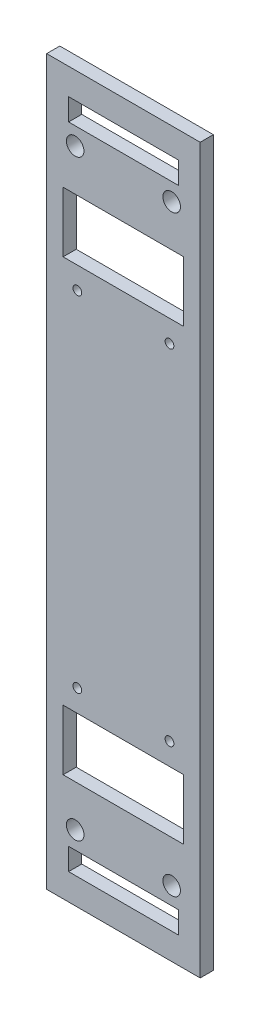
ISO-10303-21;
HEADER;
FILE_DESCRIPTION(('STEP AP214'),'2;1');
FILE_NAME('part.step','',(''),(''),'','','');
FILE_SCHEMA(('AUTOMOTIVE_DESIGN { 1 0 10303 214 1 1 1 1 }'));
ENDSEC;
DATA;
#1=APPLICATION_CONTEXT('core data for automotive mechanical design processes');
#2=APPLICATION_PROTOCOL_DEFINITION('international standard','automotive_design',2000,#1);
#3=PRODUCT_CONTEXT('',#1,'mechanical');
#4=PRODUCT('Part','Part','',(#3));
#5=PRODUCT_RELATED_PRODUCT_CATEGORY('part','',(#4));
#6=PRODUCT_DEFINITION_FORMATION('','',#4);
#7=PRODUCT_DEFINITION_CONTEXT('part definition',#1,'design');
#8=PRODUCT_DEFINITION('design','',#6,#7);
#9=PRODUCT_DEFINITION_SHAPE('','',#8);
#10=(LENGTH_UNIT() NAMED_UNIT(*) SI_UNIT(.MILLI.,.METRE.));
#11=(NAMED_UNIT(*) PLANE_ANGLE_UNIT() SI_UNIT($,.RADIAN.));
#12=(NAMED_UNIT(*) SI_UNIT($,.STERADIAN.) SOLID_ANGLE_UNIT());
#13=UNCERTAINTY_MEASURE_WITH_UNIT(LENGTH_MEASURE(1.E-05),#10,'distance_accuracy_value','');
#14=(GEOMETRIC_REPRESENTATION_CONTEXT(3) GLOBAL_UNCERTAINTY_ASSIGNED_CONTEXT((#13)) GLOBAL_UNIT_ASSIGNED_CONTEXT((#10,
#11,#12)) REPRESENTATION_CONTEXT('',''));
#15=CARTESIAN_POINT('',(0.,0.,0.));
#16=DIRECTION('',(0.,0.,1.));
#17=DIRECTION('',(1.,0.,0.));
#18=AXIS2_PLACEMENT_3D('',#15,#16,#17);
#19=CARTESIAN_POINT('',(35.,165.,6.));
#20=DIRECTION('',(-1.,0.,0.));
#21=DIRECTION('',(0.,-1.,0.));
#22=AXIS2_PLACEMENT_3D('',#19,#20,#21);
#23=PLANE('',#22);
#24=DIRECTION('',(0.,1.,0.));
#25=VECTOR('',#24,1.);
#26=CARTESIAN_POINT('',(35.,165.,0.));
#27=LINE('',#26,#25);
#28=CARTESIAN_POINT('',(35.,-165.,0.));
#29=VERTEX_POINT('',#28);
#30=CARTESIAN_POINT('',(35.,165.,0.));
#31=VERTEX_POINT('',#30);
#32=EDGE_CURVE('E345',#29,#31,#27,.T.);
#33=ORIENTED_EDGE('',*,*,#32,.T.);
#34=DIRECTION('',(0.,0.,-1.));
#35=VECTOR('',#34,1.);
#36=CARTESIAN_POINT('',(35.,165.,6.));
#37=LINE('',#36,#35);
#38=CARTESIAN_POINT('',(35.,165.,6.));
#39=VERTEX_POINT('',#38);
#40=EDGE_CURVE('E11',#39,#31,#37,.T.);
#41=ORIENTED_EDGE('',*,*,#40,.F.);
#42=DIRECTION('',(0.,1.,0.));
#43=VECTOR('',#42,1.);
#44=CARTESIAN_POINT('',(35.,165.,6.));
#45=LINE('',#44,#43);
#46=CARTESIAN_POINT('',(35.,-165.,6.));
#47=VERTEX_POINT('',#46);
#48=EDGE_CURVE('E352',#47,#39,#45,.T.);
#49=ORIENTED_EDGE('',*,*,#48,.F.);
#50=DIRECTION('',(0.,0.,-1.));
#51=VECTOR('',#50,1.);
#52=CARTESIAN_POINT('',(35.,-165.,6.));
#53=LINE('',#52,#51);
#54=EDGE_CURVE('E362',#47,#29,#53,.T.);
#55=ORIENTED_EDGE('',*,*,#54,.T.);
#56=EDGE_LOOP('',(#33,#41,#49,#55));
#57=FACE_BOUND('',#56,.T.);
#58=ADVANCED_FACE('F35',(#57),#23,.F.);
#59=CARTESIAN_POINT('',(-35.,165.,6.));
#60=DIRECTION('',(0.,-1.,0.));
#61=DIRECTION('',(0.,0.,-1.));
#62=AXIS2_PLACEMENT_3D('',#59,#60,#61);
#63=PLANE('',#62);
#64=DIRECTION('',(-1.,0.,0.));
#65=VECTOR('',#64,1.);
#66=CARTESIAN_POINT('',(-35.,165.,0.));
#67=LINE('',#66,#65);
#68=CARTESIAN_POINT('',(-35.,165.,0.));
#69=VERTEX_POINT('',#68);
#70=EDGE_CURVE('E365',#31,#69,#67,.T.);
#71=ORIENTED_EDGE('',*,*,#70,.T.);
#72=DIRECTION('',(0.,0.,-1.));
#73=VECTOR('',#72,1.);
#74=CARTESIAN_POINT('',(-35.,165.,6.));
#75=LINE('',#74,#73);
#76=CARTESIAN_POINT('',(-35.,165.,6.));
#77=VERTEX_POINT('',#76);
#78=EDGE_CURVE('E42',#77,#69,#75,.T.);
#79=ORIENTED_EDGE('',*,*,#78,.F.);
#80=DIRECTION('',(-1.,0.,0.));
#81=VECTOR('',#80,1.);
#82=CARTESIAN_POINT('',(-35.,165.,6.));
#83=LINE('',#82,#81);
#84=EDGE_CURVE('E355',#39,#77,#83,.T.);
#85=ORIENTED_EDGE('',*,*,#84,.F.);
#86=ORIENTED_EDGE('',*,*,#40,.T.);
#87=EDGE_LOOP('',(#71,#79,#85,#86));
#88=FACE_BOUND('',#87,.T.);
#89=ADVANCED_FACE('F394',(#88),#63,.F.);
#90=CARTESIAN_POINT('',(-35.,165.,6.));
#91=DIRECTION('',(1.,0.,0.));
#92=DIRECTION('',(0.,1.,0.));
#93=AXIS2_PLACEMENT_3D('',#90,#91,#92);
#94=PLANE('',#93);
#95=DIRECTION('',(0.,-1.,0.));
#96=VECTOR('',#95,1.);
#97=CARTESIAN_POINT('',(-35.,165.,0.));
#98=LINE('',#97,#96);
#99=CARTESIAN_POINT('',(-35.,-165.,0.));
#100=VERTEX_POINT('',#99);
#101=EDGE_CURVE('E367',#69,#100,#98,.T.);
#102=ORIENTED_EDGE('',*,*,#101,.T.);
#103=DIRECTION('',(0.,0.,-1.));
#104=VECTOR('',#103,1.);
#105=CARTESIAN_POINT('',(-35.,-165.,6.));
#106=LINE('',#105,#104);
#107=CARTESIAN_POINT('',(-35.,-165.,6.));
#108=VERTEX_POINT('',#107);
#109=EDGE_CURVE('E372',#108,#100,#106,.T.);
#110=ORIENTED_EDGE('',*,*,#109,.F.);
#111=DIRECTION('',(0.,-1.,0.));
#112=VECTOR('',#111,1.);
#113=CARTESIAN_POINT('',(-35.,165.,6.));
#114=LINE('',#113,#112);
#115=EDGE_CURVE('E358',#77,#108,#114,.T.);
#116=ORIENTED_EDGE('',*,*,#115,.F.);
#117=ORIENTED_EDGE('',*,*,#78,.T.);
#118=EDGE_LOOP('',(#102,#110,#116,#117));
#119=FACE_BOUND('',#118,.T.);
#120=ADVANCED_FACE('F379',(#119),#94,.F.);
#121=CARTESIAN_POINT('',(-35.,-165.,6.));
#122=DIRECTION('',(0.,1.,0.));
#123=DIRECTION('',(0.,0.,1.));
#124=AXIS2_PLACEMENT_3D('',#121,#122,#123);
#125=PLANE('',#124);
#126=DIRECTION('',(1.,0.,0.));
#127=VECTOR('',#126,1.);
#128=CARTESIAN_POINT('',(-35.,-165.,0.));
#129=LINE('',#128,#127);
#130=EDGE_CURVE('E356',#100,#29,#129,.T.);
#131=ORIENTED_EDGE('',*,*,#130,.T.);
#132=ORIENTED_EDGE('',*,*,#54,.F.);
#133=DIRECTION('',(1.,0.,0.));
#134=VECTOR('',#133,1.);
#135=CARTESIAN_POINT('',(-35.,-165.,6.));
#136=LINE('',#135,#134);
#137=EDGE_CURVE('E360',#108,#47,#136,.T.);
#138=ORIENTED_EDGE('',*,*,#137,.F.);
#139=ORIENTED_EDGE('',*,*,#109,.T.);
#140=EDGE_LOOP('',(#131,#132,#138,#139));
#141=FACE_BOUND('',#140,.T.);
#142=ADVANCED_FACE('F387',(#141),#125,.F.);
#143=CARTESIAN_POINT('',(0.,0.,6.));
#144=DIRECTION('',(0.,0.,1.));
#145=DIRECTION('',(1.,0.,0.));
#146=AXIS2_PLACEMENT_3D('',#143,#144,#145);
#147=PLANE('',#146);
#148=DIRECTION('',(0.,-1.,0.));
#149=VECTOR('',#148,1.);
#150=CARTESIAN_POINT('',(-25.,-153.,5.99999999999893));
#151=LINE('',#150,#149);
#152=CARTESIAN_POINT('',(-25.,-143.,5.999999999999));
#153=VERTEX_POINT('',#152);
#154=CARTESIAN_POINT('',(-25.,-153.,6.));
#155=VERTEX_POINT('',#154);
#156=EDGE_CURVE('E49',#153,#155,#151,.T.);
#157=ORIENTED_EDGE('',*,*,#156,.F.);
#158=DIRECTION('',(-1.,0.,0.));
#159=VECTOR('',#158,1.);
#160=CARTESIAN_POINT('',(-25.,-143.,5.999999999999));
#161=LINE('',#160,#159);
#162=CARTESIAN_POINT('',(25.,-143.,5.999999999999));
#163=VERTEX_POINT('',#162);
#164=EDGE_CURVE('E189',#163,#153,#161,.T.);
#165=ORIENTED_EDGE('',*,*,#164,.F.);
#166=DIRECTION('',(0.,1.,0.));
#167=VECTOR('',#166,1.);
#168=CARTESIAN_POINT('',(25.,-153.,5.99999999999893));
#169=LINE('',#168,#167);
#170=CARTESIAN_POINT('',(25.,-153.,5.99999999999893));
#171=VERTEX_POINT('',#170);
#172=EDGE_CURVE('E192',#171,#163,#169,.T.);
#173=ORIENTED_EDGE('',*,*,#172,.F.);
#174=DIRECTION('',(1.,0.,0.));
#175=VECTOR('',#174,1.);
#176=CARTESIAN_POINT('',(-25.,-153.,5.99999999999893));
#177=LINE('',#176,#175);
#178=EDGE_CURVE('E198',#155,#171,#177,.T.);
#179=ORIENTED_EDGE('',*,*,#178,.F.);
#180=EDGE_LOOP('',(#157,#165,#173,#179));
#181=FACE_BOUND('',#180,.T.);
#182=CARTESIAN_POINT('',(22.,-135.,5.99999999999906));
#183=DIRECTION('',(0.,0.,1.));
#184=DIRECTION('',(0.,-1.,0.));
#185=AXIS2_PLACEMENT_3D('',#182,#183,#184);
#186=CIRCLE('',#185,4.00000000000005);
#187=CARTESIAN_POINT('',(22.,-139.,5.99999999999903));
#188=VERTEX_POINT('',#187);
#189=EDGE_CURVE('E204',#188,#188,#186,.T.);
#190=ORIENTED_EDGE('',*,*,#189,.F.);
#191=EDGE_LOOP('',(#190));
#192=FACE_BOUND('',#191,.T.);
#193=CARTESIAN_POINT('',(-22.,-135.,5.99999999999906));
#194=DIRECTION('',(0.,0.,1.));
#195=DIRECTION('',(0.,1.,0.));
#196=AXIS2_PLACEMENT_3D('',#193,#194,#195);
#197=CIRCLE('',#196,3.99999999999999);
#198=CARTESIAN_POINT('',(-22.,-131.,5.99999999999909));
#199=VERTEX_POINT('',#198);
#200=EDGE_CURVE('E211',#199,#199,#197,.T.);
#201=ORIENTED_EDGE('',*,*,#200,.F.);
#202=EDGE_LOOP('',(#201));
#203=FACE_BOUND('',#202,.T.);
#204=CARTESIAN_POINT('',(21.,-78.5000000000001,5.99999999999945));
#205=DIRECTION('',(0.,0.,1.));
#206=DIRECTION('',(0.,-1.,0.));
#207=AXIS2_PLACEMENT_3D('',#204,#205,#206);
#208=CIRCLE('',#207,2.);
#209=CARTESIAN_POINT('',(21.,-80.5000000000001,5.99999999999944));
#210=VERTEX_POINT('',#209);
#211=EDGE_CURVE('E217',#210,#210,#208,.T.);
#212=ORIENTED_EDGE('',*,*,#211,.F.);
#213=EDGE_LOOP('',(#212));
#214=FACE_BOUND('',#213,.T.);
#215=CARTESIAN_POINT('',(-21.,-78.5000000000001,5.99999999999945));
#216=DIRECTION('',(0.,0.,1.));
#217=DIRECTION('',(0.,1.,0.));
#218=AXIS2_PLACEMENT_3D('',#215,#216,#217);
#219=CIRCLE('',#218,2.);
#220=CARTESIAN_POINT('',(-21.,-76.5000000000001,5.99999999999947));
#221=VERTEX_POINT('',#220);
#222=EDGE_CURVE('E223',#221,#221,#219,.T.);
#223=ORIENTED_EDGE('',*,*,#222,.F.);
#224=EDGE_LOOP('',(#223));
#225=FACE_BOUND('',#224,.T.);
#226=DIRECTION('',(0.,-1.,0.));
#227=VECTOR('',#226,1.);
#228=CARTESIAN_POINT('',(-27.5,-116.,5.99999999999919));
#229=LINE('',#228,#227);
#230=CARTESIAN_POINT('',(-27.5,-88.5000000000001,5.99999999999938));
#231=VERTEX_POINT('',#230);
#232=CARTESIAN_POINT('',(-27.5,-116.,6.));
#233=VERTEX_POINT('',#232);
#234=EDGE_CURVE('E229',#231,#233,#229,.T.);
#235=ORIENTED_EDGE('',*,*,#234,.F.);
#236=DIRECTION('',(-1.,0.,0.));
#237=VECTOR('',#236,1.);
#238=CARTESIAN_POINT('',(-27.5,-88.5000000000001,5.99999999999938));
#239=LINE('',#238,#237);
#240=CARTESIAN_POINT('',(27.5,-88.5000000000001,5.99999999999938));
#241=VERTEX_POINT('',#240);
#242=EDGE_CURVE('E236',#241,#231,#239,.T.);
#243=ORIENTED_EDGE('',*,*,#242,.F.);
#244=DIRECTION('',(0.,1.,0.));
#245=VECTOR('',#244,1.);
#246=CARTESIAN_POINT('',(27.5,-116.,5.99999999999919));
#247=LINE('',#246,#245);
#248=CARTESIAN_POINT('',(27.5,-116.,5.99999999999919));
#249=VERTEX_POINT('',#248);
#250=EDGE_CURVE('E250',#249,#241,#247,.T.);
#251=ORIENTED_EDGE('',*,*,#250,.F.);
#252=DIRECTION('',(1.,0.,0.));
#253=VECTOR('',#252,1.);
#254=CARTESIAN_POINT('',(-27.5,-116.,5.99999999999919));
#255=LINE('',#254,#253);
#256=EDGE_CURVE('E247',#233,#249,#255,.T.);
#257=ORIENTED_EDGE('',*,*,#256,.F.);
#258=EDGE_LOOP('',(#235,#243,#251,#257));
#259=FACE_BOUND('',#258,.T.);
#260=DIRECTION('',(0.,-1.,0.));
#261=VECTOR('',#260,1.);
#262=CARTESIAN_POINT('',(-25.,153.,6.));
#263=LINE('',#262,#261);
#264=CARTESIAN_POINT('',(-25.,153.,6.));
#265=VERTEX_POINT('',#264);
#266=CARTESIAN_POINT('',(-25.,143.,6.));
#267=VERTEX_POINT('',#266);
#268=EDGE_CURVE('E257',#265,#267,#263,.T.);
#269=ORIENTED_EDGE('',*,*,#268,.F.);
#270=DIRECTION('',(-1.,0.,0.));
#271=VECTOR('',#270,1.);
#272=CARTESIAN_POINT('',(-25.,153.,6.));
#273=LINE('',#272,#271);
#274=CARTESIAN_POINT('',(25.,153.,6.));
#275=VERTEX_POINT('',#274);
#276=EDGE_CURVE('E268',#275,#265,#273,.T.);
#277=ORIENTED_EDGE('',*,*,#276,.F.);
#278=DIRECTION('',(0.,1.,0.));
#279=VECTOR('',#278,1.);
#280=CARTESIAN_POINT('',(25.,153.,6.));
#281=LINE('',#280,#279);
#282=CARTESIAN_POINT('',(25.,143.,6.));
#283=VERTEX_POINT('',#282);
#284=EDGE_CURVE('E282',#283,#275,#281,.T.);
#285=ORIENTED_EDGE('',*,*,#284,.F.);
#286=DIRECTION('',(1.,0.,0.));
#287=VECTOR('',#286,1.);
#288=CARTESIAN_POINT('',(-25.,143.,6.));
#289=LINE('',#288,#287);
#290=EDGE_CURVE('E279',#267,#283,#289,.T.);
#291=ORIENTED_EDGE('',*,*,#290,.F.);
#292=EDGE_LOOP('',(#269,#277,#285,#291));
#293=FACE_BOUND('',#292,.T.);
#294=CARTESIAN_POINT('',(22.,135.,6.));
#295=DIRECTION('',(0.,0.,1.));
#296=DIRECTION('',(-1.,0.,0.));
#297=AXIS2_PLACEMENT_3D('',#294,#295,#296);
#298=CIRCLE('',#297,4.00000000000005);
#299=CARTESIAN_POINT('',(17.9999999999999,135.,6.));
#300=VERTEX_POINT('',#299);
#301=EDGE_CURVE('E289',#300,#300,#298,.T.);
#302=ORIENTED_EDGE('',*,*,#301,.F.);
#303=EDGE_LOOP('',(#302));
#304=FACE_BOUND('',#303,.T.);
#305=CARTESIAN_POINT('',(-22.,135.,6.));
#306=DIRECTION('',(0.,0.,1.));
#307=DIRECTION('',(1.,0.,0.));
#308=AXIS2_PLACEMENT_3D('',#305,#306,#307);
#309=CIRCLE('',#308,3.99999999999999);
#310=CARTESIAN_POINT('',(-18.,135.,6.));
#311=VERTEX_POINT('',#310);
#312=EDGE_CURVE('E299',#311,#311,#309,.T.);
#313=ORIENTED_EDGE('',*,*,#312,.F.);
#314=EDGE_LOOP('',(#313));
#315=FACE_BOUND('',#314,.T.);
#316=CARTESIAN_POINT('',(21.,78.5000000000001,6.));
#317=DIRECTION('',(0.,0.,1.));
#318=DIRECTION('',(-1.,0.,0.));
#319=AXIS2_PLACEMENT_3D('',#316,#317,#318);
#320=CIRCLE('',#319,2.);
#321=CARTESIAN_POINT('',(19.,78.5000000000001,6.));
#322=VERTEX_POINT('',#321);
#323=EDGE_CURVE('E305',#322,#322,#320,.T.);
#324=ORIENTED_EDGE('',*,*,#323,.F.);
#325=EDGE_LOOP('',(#324));
#326=FACE_BOUND('',#325,.T.);
#327=CARTESIAN_POINT('',(-21.,78.5000000000001,6.));
#328=DIRECTION('',(0.,0.,1.));
#329=DIRECTION('',(1.,0.,0.));
#330=AXIS2_PLACEMENT_3D('',#327,#328,#329);
#331=CIRCLE('',#330,2.);
#332=CARTESIAN_POINT('',(-19.,78.5000000000001,6.));
#333=VERTEX_POINT('',#332);
#334=EDGE_CURVE('E311',#333,#333,#331,.T.);
#335=ORIENTED_EDGE('',*,*,#334,.F.);
#336=EDGE_LOOP('',(#335));
#337=FACE_BOUND('',#336,.T.);
#338=DIRECTION('',(0.,-1.,0.));
#339=VECTOR('',#338,1.);
#340=CARTESIAN_POINT('',(-27.5,116.,6.));
#341=LINE('',#340,#339);
#342=CARTESIAN_POINT('',(-27.5,116.,6.));
#343=VERTEX_POINT('',#342);
#344=CARTESIAN_POINT('',(-27.5,88.5000000000001,6.));
#345=VERTEX_POINT('',#344);
#346=EDGE_CURVE('E317',#343,#345,#341,.T.);
#347=ORIENTED_EDGE('',*,*,#346,.F.);
#348=DIRECTION('',(-1.,0.,0.));
#349=VECTOR('',#348,1.);
#350=CARTESIAN_POINT('',(-27.5,116.,6.));
#351=LINE('',#350,#349);
#352=CARTESIAN_POINT('',(27.5,116.,6.));
#353=VERTEX_POINT('',#352);
#354=EDGE_CURVE('E324',#353,#343,#351,.T.);
#355=ORIENTED_EDGE('',*,*,#354,.F.);
#356=DIRECTION('',(0.,1.,0.));
#357=VECTOR('',#356,1.);
#358=CARTESIAN_POINT('',(27.5,116.,6.));
#359=LINE('',#358,#357);
#360=CARTESIAN_POINT('',(27.5,88.5000000000001,6.));
#361=VERTEX_POINT('',#360);
#362=EDGE_CURVE('E338',#361,#353,#359,.T.);
#363=ORIENTED_EDGE('',*,*,#362,.F.);
#364=DIRECTION('',(1.,0.,0.));
#365=VECTOR('',#364,1.);
#366=CARTESIAN_POINT('',(-27.5,88.5000000000001,6.));
#367=LINE('',#366,#365);
#368=EDGE_CURVE('E335',#345,#361,#367,.T.);
#369=ORIENTED_EDGE('',*,*,#368,.F.);
#370=EDGE_LOOP('',(#347,#355,#363,#369));
#371=FACE_BOUND('',#370,.T.);
#372=ORIENTED_EDGE('',*,*,#48,.T.);
#373=ORIENTED_EDGE('',*,*,#84,.T.);
#374=ORIENTED_EDGE('',*,*,#115,.T.);
#375=ORIENTED_EDGE('',*,*,#137,.T.);
#376=EDGE_LOOP('',(#372,#373,#374,#375));
#377=FACE_BOUND('',#376,.T.);
#378=ADVANCED_FACE('F393',(#181,#192,#203,#214,#225,#259,#293,#304,#315,#326,#337,#371,#377),
#147,.T.);
#379=CARTESIAN_POINT('',(0.,0.,0.));
#380=DIRECTION('',(0.,0.,1.));
#381=DIRECTION('',(1.,0.,0.));
#382=AXIS2_PLACEMENT_3D('',#379,#380,#381);
#383=PLANE('',#382);
#384=DIRECTION('',(-1.,0.,0.));
#385=VECTOR('',#384,1.);
#386=CARTESIAN_POINT('',(-25.,-143.,-9.99200722162641E-13));
#387=LINE('',#386,#385);
#388=CARTESIAN_POINT('',(25.,-143.,-9.99200722162641E-13));
#389=VERTEX_POINT('',#388);
#390=CARTESIAN_POINT('',(-25.,-143.,-9.99200722162641E-13));
#391=VERTEX_POINT('',#390);
#392=EDGE_CURVE('E179',#389,#391,#387,.T.);
#393=ORIENTED_EDGE('',*,*,#392,.T.);
#394=DIRECTION('',(0.,-1.,0.));
#395=VECTOR('',#394,1.);
#396=CARTESIAN_POINT('',(-25.,-153.,-1.06858966120171E-12));
#397=LINE('',#396,#395);
#398=CARTESIAN_POINT('',(-25.,-153.,-1.06858966120171E-12));
#399=VERTEX_POINT('',#398);
#400=EDGE_CURVE('E173',#391,#399,#397,.T.);
#401=ORIENTED_EDGE('',*,*,#400,.T.);
#402=DIRECTION('',(1.,0.,0.));
#403=VECTOR('',#402,1.);
#404=CARTESIAN_POINT('',(-25.,-153.,-1.06858966120171E-12));
#405=LINE('',#404,#403);
#406=CARTESIAN_POINT('',(25.,-153.,0.));
#407=VERTEX_POINT('',#406);
#408=EDGE_CURVE('E182',#399,#407,#405,.T.);
#409=ORIENTED_EDGE('',*,*,#408,.T.);
#410=DIRECTION('',(0.,1.,0.));
#411=VECTOR('',#410,1.);
#412=CARTESIAN_POINT('',(25.,-153.,-1.06858966120171E-12));
#413=LINE('',#412,#411);
#414=EDGE_CURVE('E57',#407,#389,#413,.T.);
#415=ORIENTED_EDGE('',*,*,#414,.T.);
#416=EDGE_LOOP('',(#393,#401,#409,#415));
#417=FACE_BOUND('',#416,.T.);
#418=CARTESIAN_POINT('',(22.,-135.,-9.42822209193395E-13));
#419=DIRECTION('',(0.,0.,1.));
#420=DIRECTION('',(0.,-1.,0.));
#421=AXIS2_PLACEMENT_3D('',#418,#419,#420);
#422=CIRCLE('',#421,4.00000000000005);
#423=CARTESIAN_POINT('',(22.,-139.,-9.7075405990414E-13));
#424=VERTEX_POINT('',#423);
#425=EDGE_CURVE('E208',#424,#424,#422,.T.);
#426=ORIENTED_EDGE('',*,*,#425,.T.);
#427=EDGE_LOOP('',(#426));
#428=FACE_BOUND('',#427,.T.);
#429=CARTESIAN_POINT('',(-22.,-135.,-9.42822209193395E-13));
#430=DIRECTION('',(0.,0.,1.));
#431=DIRECTION('',(0.,1.,0.));
#432=AXIS2_PLACEMENT_3D('',#429,#430,#431);
#433=CIRCLE('',#432,3.99999999999999);
#434=CARTESIAN_POINT('',(-22.,-131.,-9.1489035848265E-13));
#435=VERTEX_POINT('',#434);
#436=EDGE_CURVE('E214',#435,#435,#433,.T.);
#437=ORIENTED_EDGE('',*,*,#436,.T.);
#438=EDGE_LOOP('',(#437));
#439=FACE_BOUND('',#438,.T.);
#440=CARTESIAN_POINT('',(21.,-78.5000000000001,-5.48172618408671E-13));
#441=DIRECTION('',(0.,0.,1.));
#442=DIRECTION('',(0.,-1.,0.));
#443=AXIS2_PLACEMENT_3D('',#440,#441,#442);
#444=CIRCLE('',#443,2.);
#445=CARTESIAN_POINT('',(21.,-80.5000000000001,-5.62138543764044E-13));
#446=VERTEX_POINT('',#445);
#447=EDGE_CURVE('E220',#446,#446,#444,.T.);
#448=ORIENTED_EDGE('',*,*,#447,.T.);
#449=EDGE_LOOP('',(#448));
#450=FACE_BOUND('',#449,.T.);
#451=CARTESIAN_POINT('',(-21.,-78.5000000000001,-5.48172618408671E-13));
#452=DIRECTION('',(0.,0.,1.));
#453=DIRECTION('',(0.,1.,0.));
#454=AXIS2_PLACEMENT_3D('',#451,#452,#453);
#455=CIRCLE('',#454,2.);
#456=CARTESIAN_POINT('',(-21.,-76.5000000000001,-5.34206693053299E-13));
#457=VERTEX_POINT('',#456);
#458=EDGE_CURVE('E226',#457,#457,#455,.T.);
#459=ORIENTED_EDGE('',*,*,#458,.T.);
#460=EDGE_LOOP('',(#459));
#461=FACE_BOUND('',#460,.T.);
#462=DIRECTION('',(-1.,0.,0.));
#463=VECTOR('',#462,1.);
#464=CARTESIAN_POINT('',(-27.5,-88.5000000000001,-6.18428919185732E-13));
#465=LINE('',#464,#463);
#466=CARTESIAN_POINT('',(27.5,-88.5000000000001,-6.18428919185732E-13));
#467=VERTEX_POINT('',#466);
#468=CARTESIAN_POINT('',(-27.5,-88.5000000000001,-6.18428919185732E-13));
#469=VERTEX_POINT('',#468);
#470=EDGE_CURVE('E242',#467,#469,#465,.T.);
#471=ORIENTED_EDGE('',*,*,#470,.T.);
#472=DIRECTION('',(0.,-1.,0.));
#473=VECTOR('',#472,1.);
#474=CARTESIAN_POINT('',(-27.5,-116.,-8.10115863281169E-13));
#475=LINE('',#474,#473);
#476=CARTESIAN_POINT('',(-27.5,-116.,-8.10115863281169E-13));
#477=VERTEX_POINT('',#476);
#478=EDGE_CURVE('E232',#469,#477,#475,.T.);
#479=ORIENTED_EDGE('',*,*,#478,.T.);
#480=DIRECTION('',(1.,0.,0.));
#481=VECTOR('',#480,1.);
#482=CARTESIAN_POINT('',(-27.5,-116.,-8.10115863281169E-13));
#483=LINE('',#482,#481);
#484=CARTESIAN_POINT('',(27.5,-116.,0.));
#485=VERTEX_POINT('',#484);
#486=EDGE_CURVE('E235',#477,#485,#483,.T.);
#487=ORIENTED_EDGE('',*,*,#486,.T.);
#488=DIRECTION('',(0.,1.,0.));
#489=VECTOR('',#488,1.);
#490=CARTESIAN_POINT('',(27.5,-116.,-8.10115863281169E-13));
#491=LINE('',#490,#489);
#492=EDGE_CURVE('E239',#485,#467,#491,.T.);
#493=ORIENTED_EDGE('',*,*,#492,.T.);
#494=EDGE_LOOP('',(#471,#479,#487,#493));
#495=FACE_BOUND('',#494,.T.);
#496=DIRECTION('',(-1.,0.,0.));
#497=VECTOR('',#496,1.);
#498=CARTESIAN_POINT('',(-25.,153.,0.));
#499=LINE('',#498,#497);
#500=CARTESIAN_POINT('',(25.,153.,0.));
#501=VERTEX_POINT('',#500);
#502=CARTESIAN_POINT('',(-25.,153.,0.));
#503=VERTEX_POINT('',#502);
#504=EDGE_CURVE('E274',#501,#503,#499,.T.);
#505=ORIENTED_EDGE('',*,*,#504,.T.);
#506=DIRECTION('',(0.,-1.,0.));
#507=VECTOR('',#506,1.);
#508=CARTESIAN_POINT('',(-25.,153.,0.));
#509=LINE('',#508,#507);
#510=CARTESIAN_POINT('',(-25.,143.,0.));
#511=VERTEX_POINT('',#510);
#512=EDGE_CURVE('E264',#503,#511,#509,.T.);
#513=ORIENTED_EDGE('',*,*,#512,.T.);
#514=DIRECTION('',(1.,0.,0.));
#515=VECTOR('',#514,1.);
#516=CARTESIAN_POINT('',(-25.,143.,0.));
#517=LINE('',#516,#515);
#518=CARTESIAN_POINT('',(25.,143.,0.));
#519=VERTEX_POINT('',#518);
#520=EDGE_CURVE('E267',#511,#519,#517,.T.);
#521=ORIENTED_EDGE('',*,*,#520,.T.);
#522=DIRECTION('',(0.,1.,0.));
#523=VECTOR('',#522,1.);
#524=CARTESIAN_POINT('',(25.,153.,0.));
#525=LINE('',#524,#523);
#526=EDGE_CURVE('E271',#519,#501,#525,.T.);
#527=ORIENTED_EDGE('',*,*,#526,.T.);
#528=EDGE_LOOP('',(#505,#513,#521,#527));
#529=FACE_BOUND('',#528,.T.);
#530=CARTESIAN_POINT('',(22.,135.,0.));
#531=DIRECTION('',(0.,0.,1.));
#532=DIRECTION('',(-1.,0.,0.));
#533=AXIS2_PLACEMENT_3D('',#530,#531,#532);
#534=CIRCLE('',#533,4.00000000000005);
#535=CARTESIAN_POINT('',(17.9999999999999,135.,0.));
#536=VERTEX_POINT('',#535);
#537=EDGE_CURVE('E296',#536,#536,#534,.T.);
#538=ORIENTED_EDGE('',*,*,#537,.T.);
#539=EDGE_LOOP('',(#538));
#540=FACE_BOUND('',#539,.T.);
#541=CARTESIAN_POINT('',(-22.,135.,0.));
#542=DIRECTION('',(0.,0.,1.));
#543=DIRECTION('',(1.,0.,0.));
#544=AXIS2_PLACEMENT_3D('',#541,#542,#543);
#545=CIRCLE('',#544,3.99999999999999);
#546=CARTESIAN_POINT('',(-18.,135.,0.));
#547=VERTEX_POINT('',#546);
#548=EDGE_CURVE('E302',#547,#547,#545,.T.);
#549=ORIENTED_EDGE('',*,*,#548,.T.);
#550=EDGE_LOOP('',(#549));
#551=FACE_BOUND('',#550,.T.);
#552=CARTESIAN_POINT('',(21.,78.5000000000001,0.));
#553=DIRECTION('',(0.,0.,1.));
#554=DIRECTION('',(-1.,0.,0.));
#555=AXIS2_PLACEMENT_3D('',#552,#553,#554);
#556=CIRCLE('',#555,2.);
#557=CARTESIAN_POINT('',(19.,78.5000000000001,0.));
#558=VERTEX_POINT('',#557);
#559=EDGE_CURVE('E308',#558,#558,#556,.T.);
#560=ORIENTED_EDGE('',*,*,#559,.T.);
#561=EDGE_LOOP('',(#560));
#562=FACE_BOUND('',#561,.T.);
#563=CARTESIAN_POINT('',(-21.,78.5000000000001,0.));
#564=DIRECTION('',(0.,0.,1.));
#565=DIRECTION('',(1.,0.,0.));
#566=AXIS2_PLACEMENT_3D('',#563,#564,#565);
#567=CIRCLE('',#566,2.);
#568=CARTESIAN_POINT('',(-19.,78.5000000000001,0.));
#569=VERTEX_POINT('',#568);
#570=EDGE_CURVE('E314',#569,#569,#567,.T.);
#571=ORIENTED_EDGE('',*,*,#570,.T.);
#572=EDGE_LOOP('',(#571));
#573=FACE_BOUND('',#572,.T.);
#574=DIRECTION('',(-1.,0.,0.));
#575=VECTOR('',#574,1.);
#576=CARTESIAN_POINT('',(-27.5,116.,0.));
#577=LINE('',#576,#575);
#578=CARTESIAN_POINT('',(27.5,116.,0.));
#579=VERTEX_POINT('',#578);
#580=CARTESIAN_POINT('',(-27.5,116.,0.));
#581=VERTEX_POINT('',#580);
#582=EDGE_CURVE('E330',#579,#581,#577,.T.);
#583=ORIENTED_EDGE('',*,*,#582,.T.);
#584=DIRECTION('',(0.,-1.,0.));
#585=VECTOR('',#584,1.);
#586=CARTESIAN_POINT('',(-27.5,116.,0.));
#587=LINE('',#586,#585);
#588=CARTESIAN_POINT('',(-27.5,88.5000000000001,0.));
#589=VERTEX_POINT('',#588);
#590=EDGE_CURVE('E320',#581,#589,#587,.T.);
#591=ORIENTED_EDGE('',*,*,#590,.T.);
#592=DIRECTION('',(1.,0.,0.));
#593=VECTOR('',#592,1.);
#594=CARTESIAN_POINT('',(-27.5,88.5000000000001,0.));
#595=LINE('',#594,#593);
#596=CARTESIAN_POINT('',(27.5,88.5000000000001,0.));
#597=VERTEX_POINT('',#596);
#598=EDGE_CURVE('E323',#589,#597,#595,.T.);
#599=ORIENTED_EDGE('',*,*,#598,.T.);
#600=DIRECTION('',(0.,1.,0.));
#601=VECTOR('',#600,1.);
#602=CARTESIAN_POINT('',(27.5,116.,0.));
#603=LINE('',#602,#601);
#604=EDGE_CURVE('E327',#597,#579,#603,.T.);
#605=ORIENTED_EDGE('',*,*,#604,.T.);
#606=EDGE_LOOP('',(#583,#591,#599,#605));
#607=FACE_BOUND('',#606,.T.);
#608=ORIENTED_EDGE('',*,*,#32,.F.);
#609=ORIENTED_EDGE('',*,*,#130,.F.);
#610=ORIENTED_EDGE('',*,*,#101,.F.);
#611=ORIENTED_EDGE('',*,*,#70,.F.);
#612=EDGE_LOOP('',(#608,#609,#610,#611));
#613=FACE_BOUND('',#612,.T.);
#614=ADVANCED_FACE('F186',(#417,#428,#439,#450,#461,#495,#529,#540,#551,#562,#573,#607,#613),
#383,.F.);
#615=CARTESIAN_POINT('',(-27.5,116.,0.));
#616=DIRECTION('',(-1.,0.,0.));
#617=DIRECTION('',(0.,0.,1.));
#618=AXIS2_PLACEMENT_3D('',#615,#616,#617);
#619=PLANE('',#618);
#620=ORIENTED_EDGE('',*,*,#346,.T.);
#621=DIRECTION('',(0.,0.,1.));
#622=VECTOR('',#621,1.);
#623=CARTESIAN_POINT('',(-27.5,88.5000000000001,0.));
#624=LINE('',#623,#622);
#625=EDGE_CURVE('E333',#589,#345,#624,.T.);
#626=ORIENTED_EDGE('',*,*,#625,.F.);
#627=ORIENTED_EDGE('',*,*,#590,.F.);
#628=DIRECTION('',(0.,0.,1.));
#629=VECTOR('',#628,1.);
#630=CARTESIAN_POINT('',(-27.5,116.,0.));
#631=LINE('',#630,#629);
#632=EDGE_CURVE('E343',#581,#343,#631,.T.);
#633=ORIENTED_EDGE('',*,*,#632,.T.);
#634=EDGE_LOOP('',(#620,#626,#627,#633));
#635=FACE_BOUND('',#634,.T.);
#636=ADVANCED_FACE('F406',(#635),#619,.F.);
#637=CARTESIAN_POINT('',(-27.5,116.,0.));
#638=DIRECTION('',(0.,1.,0.));
#639=DIRECTION('',(0.,0.,1.));
#640=AXIS2_PLACEMENT_3D('',#637,#638,#639);
#641=PLANE('',#640);
#642=ORIENTED_EDGE('',*,*,#354,.T.);
#643=ORIENTED_EDGE('',*,*,#632,.F.);
#644=ORIENTED_EDGE('',*,*,#582,.F.);
#645=DIRECTION('',(0.,0.,1.));
#646=VECTOR('',#645,1.);
#647=CARTESIAN_POINT('',(27.5,116.,0.));
#648=LINE('',#647,#646);
#649=EDGE_CURVE('E346',#579,#353,#648,.T.);
#650=ORIENTED_EDGE('',*,*,#649,.T.);
#651=EDGE_LOOP('',(#642,#643,#644,#650));
#652=FACE_BOUND('',#651,.T.);
#653=ADVANCED_FACE('F412',(#652),#641,.F.);
#654=CARTESIAN_POINT('',(27.5,116.,0.));
#655=DIRECTION('',(1.,0.,0.));
#656=DIRECTION('',(0.,0.,-1.));
#657=AXIS2_PLACEMENT_3D('',#654,#655,#656);
#658=PLANE('',#657);
#659=ORIENTED_EDGE('',*,*,#362,.T.);
#660=ORIENTED_EDGE('',*,*,#649,.F.);
#661=ORIENTED_EDGE('',*,*,#604,.F.);
#662=DIRECTION('',(0.,0.,1.));
#663=VECTOR('',#662,1.);
#664=CARTESIAN_POINT('',(27.5,88.5000000000001,0.));
#665=LINE('',#664,#663);
#666=EDGE_CURVE('E348',#597,#361,#665,.T.);
#667=ORIENTED_EDGE('',*,*,#666,.T.);
#668=EDGE_LOOP('',(#659,#660,#661,#667));
#669=FACE_BOUND('',#668,.T.);
#670=ADVANCED_FACE('F418',(#669),#658,.F.);
#671=CARTESIAN_POINT('',(-27.5,88.5000000000001,0.));
#672=DIRECTION('',(0.,-1.,0.));
#673=DIRECTION('',(0.,0.,-1.));
#674=AXIS2_PLACEMENT_3D('',#671,#672,#673);
#675=PLANE('',#674);
#676=ORIENTED_EDGE('',*,*,#368,.T.);
#677=ORIENTED_EDGE('',*,*,#666,.F.);
#678=ORIENTED_EDGE('',*,*,#598,.F.);
#679=ORIENTED_EDGE('',*,*,#625,.T.);
#680=EDGE_LOOP('',(#676,#677,#678,#679));
#681=FACE_BOUND('',#680,.T.);
#682=ADVANCED_FACE('F414',(#681),#675,.F.);
#683=CARTESIAN_POINT('',(-21.,78.5000000000001,0.));
#684=DIRECTION('',(0.,0.,1.));
#685=DIRECTION('',(1.,0.,0.));
#686=AXIS2_PLACEMENT_3D('',#683,#684,#685);
#687=CYLINDRICAL_SURFACE('',#686,2.);
#688=ORIENTED_EDGE('',*,*,#570,.F.);
#689=EDGE_LOOP('',(#688));
#690=FACE_BOUND('',#689,.T.);
#691=ORIENTED_EDGE('',*,*,#334,.T.);
#692=EDGE_LOOP('',(#691));
#693=FACE_BOUND('',#692,.T.);
#694=ADVANCED_FACE('F417',(#690,#693),#687,.F.);
#695=CARTESIAN_POINT('',(21.,78.5000000000001,0.));
#696=DIRECTION('',(0.,0.,1.));
#697=DIRECTION('',(1.,0.,0.));
#698=AXIS2_PLACEMENT_3D('',#695,#696,#697);
#699=CYLINDRICAL_SURFACE('',#698,2.);
#700=ORIENTED_EDGE('',*,*,#559,.F.);
#701=EDGE_LOOP('',(#700));
#702=FACE_BOUND('',#701,.T.);
#703=ORIENTED_EDGE('',*,*,#323,.T.);
#704=EDGE_LOOP('',(#703));
#705=FACE_BOUND('',#704,.T.);
#706=ADVANCED_FACE('F428',(#702,#705),#699,.F.);
#707=CARTESIAN_POINT('',(-22.,135.,0.));
#708=DIRECTION('',(0.,0.,1.));
#709=DIRECTION('',(1.,0.,0.));
#710=AXIS2_PLACEMENT_3D('',#707,#708,#709);
#711=CYLINDRICAL_SURFACE('',#710,3.99999999999999);
#712=ORIENTED_EDGE('',*,*,#548,.F.);
#713=EDGE_LOOP('',(#712));
#714=FACE_BOUND('',#713,.T.);
#715=ORIENTED_EDGE('',*,*,#312,.T.);
#716=EDGE_LOOP('',(#715));
#717=FACE_BOUND('',#716,.T.);
#718=ADVANCED_FACE('F432',(#714,#717),#711,.F.);
#719=CARTESIAN_POINT('',(22.,135.,0.));
#720=DIRECTION('',(0.,0.,1.));
#721=DIRECTION('',(1.,0.,0.));
#722=AXIS2_PLACEMENT_3D('',#719,#720,#721);
#723=CYLINDRICAL_SURFACE('',#722,4.00000000000005);
#724=ORIENTED_EDGE('',*,*,#537,.F.);
#725=EDGE_LOOP('',(#724));
#726=FACE_BOUND('',#725,.T.);
#727=ORIENTED_EDGE('',*,*,#301,.T.);
#728=EDGE_LOOP('',(#727));
#729=FACE_BOUND('',#728,.T.);
#730=ADVANCED_FACE('F436',(#726,#729),#723,.F.);
#731=CARTESIAN_POINT('',(-25.,153.,0.));
#732=DIRECTION('',(-1.,0.,0.));
#733=DIRECTION('',(0.,0.,1.));
#734=AXIS2_PLACEMENT_3D('',#731,#732,#733);
#735=PLANE('',#734);
#736=ORIENTED_EDGE('',*,*,#268,.T.);
#737=DIRECTION('',(0.,0.,1.));
#738=VECTOR('',#737,1.);
#739=CARTESIAN_POINT('',(-25.,143.,0.));
#740=LINE('',#739,#738);
#741=EDGE_CURVE('E277',#511,#267,#740,.T.);
#742=ORIENTED_EDGE('',*,*,#741,.F.);
#743=ORIENTED_EDGE('',*,*,#512,.F.);
#744=DIRECTION('',(0.,0.,1.));
#745=VECTOR('',#744,1.);
#746=CARTESIAN_POINT('',(-25.,153.,0.));
#747=LINE('',#746,#745);
#748=EDGE_CURVE('E287',#503,#265,#747,.T.);
#749=ORIENTED_EDGE('',*,*,#748,.T.);
#750=EDGE_LOOP('',(#736,#742,#743,#749));
#751=FACE_BOUND('',#750,.T.);
#752=ADVANCED_FACE('F440',(#751),#735,.F.);
#753=CARTESIAN_POINT('',(-25.,153.,0.));
#754=DIRECTION('',(0.,1.,0.));
#755=DIRECTION('',(0.,0.,1.));
#756=AXIS2_PLACEMENT_3D('',#753,#754,#755);
#757=PLANE('',#756);
#758=ORIENTED_EDGE('',*,*,#276,.T.);
#759=ORIENTED_EDGE('',*,*,#748,.F.);
#760=ORIENTED_EDGE('',*,*,#504,.F.);
#761=DIRECTION('',(0.,0.,1.));
#762=VECTOR('',#761,1.);
#763=CARTESIAN_POINT('',(25.,153.,0.));
#764=LINE('',#763,#762);
#765=EDGE_CURVE('E290',#501,#275,#764,.T.);
#766=ORIENTED_EDGE('',*,*,#765,.T.);
#767=EDGE_LOOP('',(#758,#759,#760,#766));
#768=FACE_BOUND('',#767,.T.);
#769=ADVANCED_FACE('F444',(#768),#757,.F.);
#770=CARTESIAN_POINT('',(25.,153.,0.));
#771=DIRECTION('',(1.,0.,0.));
#772=DIRECTION('',(0.,0.,-1.));
#773=AXIS2_PLACEMENT_3D('',#770,#771,#772);
#774=PLANE('',#773);
#775=ORIENTED_EDGE('',*,*,#284,.T.);
#776=ORIENTED_EDGE('',*,*,#765,.F.);
#777=ORIENTED_EDGE('',*,*,#526,.F.);
#778=DIRECTION('',(0.,0.,1.));
#779=VECTOR('',#778,1.);
#780=CARTESIAN_POINT('',(25.,143.,0.));
#781=LINE('',#780,#779);
#782=EDGE_CURVE('E292',#519,#283,#781,.T.);
#783=ORIENTED_EDGE('',*,*,#782,.T.);
#784=EDGE_LOOP('',(#775,#776,#777,#783));
#785=FACE_BOUND('',#784,.T.);
#786=ADVANCED_FACE('F450',(#785),#774,.F.);
#787=CARTESIAN_POINT('',(-25.,143.,0.));
#788=DIRECTION('',(0.,-1.,0.));
#789=DIRECTION('',(0.,0.,-1.));
#790=AXIS2_PLACEMENT_3D('',#787,#788,#789);
#791=PLANE('',#790);
#792=ORIENTED_EDGE('',*,*,#290,.T.);
#793=ORIENTED_EDGE('',*,*,#782,.F.);
#794=ORIENTED_EDGE('',*,*,#520,.F.);
#795=ORIENTED_EDGE('',*,*,#741,.T.);
#796=EDGE_LOOP('',(#792,#793,#794,#795));
#797=FACE_BOUND('',#796,.T.);
#798=ADVANCED_FACE('F446',(#797),#791,.F.);
#799=CARTESIAN_POINT('',(-27.5,-116.,-8.10115863281169E-13));
#800=DIRECTION('',(-1.,0.,0.));
#801=DIRECTION('',(0.,0.,1.));
#802=AXIS2_PLACEMENT_3D('',#799,#800,#801);
#803=PLANE('',#802);
#804=ORIENTED_EDGE('',*,*,#234,.T.);
#805=DIRECTION('',(0.,0.,1.));
#806=VECTOR('',#805,1.);
#807=CARTESIAN_POINT('',(-27.5,-116.,-8.10115863281169E-13));
#808=LINE('',#807,#806);
#809=EDGE_CURVE('E245',#477,#233,#808,.T.);
#810=ORIENTED_EDGE('',*,*,#809,.F.);
#811=ORIENTED_EDGE('',*,*,#478,.F.);
#812=DIRECTION('',(0.,0.,1.));
#813=VECTOR('',#812,1.);
#814=CARTESIAN_POINT('',(-27.5,-88.5000000000001,-6.18428919185732E-13));
#815=LINE('',#814,#813);
#816=EDGE_CURVE('E255',#469,#231,#815,.T.);
#817=ORIENTED_EDGE('',*,*,#816,.T.);
#818=EDGE_LOOP('',(#804,#810,#811,#817));
#819=FACE_BOUND('',#818,.T.);
#820=ADVANCED_FACE('F449',(#819),#803,.F.);
#821=CARTESIAN_POINT('',(-27.5,-88.5000000000001,-6.18428919185732E-13));
#822=DIRECTION('',(0.,1.,0.));
#823=DIRECTION('',(0.,0.,1.));
#824=AXIS2_PLACEMENT_3D('',#821,#822,#823);
#825=PLANE('',#824);
#826=ORIENTED_EDGE('',*,*,#242,.T.);
#827=ORIENTED_EDGE('',*,*,#816,.F.);
#828=ORIENTED_EDGE('',*,*,#470,.F.);
#829=DIRECTION('',(0.,0.,1.));
#830=VECTOR('',#829,1.);
#831=CARTESIAN_POINT('',(27.5,-88.5000000000001,-6.18428919185732E-13));
#832=LINE('',#831,#830);
#833=EDGE_CURVE('E258',#467,#241,#832,.T.);
#834=ORIENTED_EDGE('',*,*,#833,.T.);
#835=EDGE_LOOP('',(#826,#827,#828,#834));
#836=FACE_BOUND('',#835,.T.);
#837=ADVANCED_FACE('F460',(#836),#825,.F.);
#838=CARTESIAN_POINT('',(27.5,-116.,-8.10115863281169E-13));
#839=DIRECTION('',(1.,0.,0.));
#840=DIRECTION('',(0.,0.,-1.));
#841=AXIS2_PLACEMENT_3D('',#838,#839,#840);
#842=PLANE('',#841);
#843=ORIENTED_EDGE('',*,*,#250,.T.);
#844=ORIENTED_EDGE('',*,*,#833,.F.);
#845=ORIENTED_EDGE('',*,*,#492,.F.);
#846=DIRECTION('',(0.,0.,1.));
#847=VECTOR('',#846,1.);
#848=CARTESIAN_POINT('',(27.5,-116.,-8.10115863281169E-13));
#849=LINE('',#848,#847);
#850=EDGE_CURVE('E260',#485,#249,#849,.T.);
#851=ORIENTED_EDGE('',*,*,#850,.T.);
#852=EDGE_LOOP('',(#843,#844,#845,#851));
#853=FACE_BOUND('',#852,.T.);
#854=ADVANCED_FACE('F466',(#853),#842,.F.);
#855=CARTESIAN_POINT('',(-27.5,-116.,-8.10115863281169E-13));
#856=DIRECTION('',(0.,-1.,0.));
#857=DIRECTION('',(0.,0.,-1.));
#858=AXIS2_PLACEMENT_3D('',#855,#856,#857);
#859=PLANE('',#858);
#860=ORIENTED_EDGE('',*,*,#256,.T.);
#861=ORIENTED_EDGE('',*,*,#850,.F.);
#862=ORIENTED_EDGE('',*,*,#486,.F.);
#863=ORIENTED_EDGE('',*,*,#809,.T.);
#864=EDGE_LOOP('',(#860,#861,#862,#863));
#865=FACE_BOUND('',#864,.T.);
#866=ADVANCED_FACE('F462',(#865),#859,.F.);
#867=CARTESIAN_POINT('',(-21.,-78.5000000000001,-5.48172618408671E-13));
#868=DIRECTION('',(0.,0.,1.));
#869=DIRECTION('',(1.,0.,0.));
#870=AXIS2_PLACEMENT_3D('',#867,#868,#869);
#871=CYLINDRICAL_SURFACE('',#870,2.);
#872=ORIENTED_EDGE('',*,*,#458,.F.);
#873=EDGE_LOOP('',(#872));
#874=FACE_BOUND('',#873,.T.);
#875=ORIENTED_EDGE('',*,*,#222,.T.);
#876=EDGE_LOOP('',(#875));
#877=FACE_BOUND('',#876,.T.);
#878=ADVANCED_FACE('F465',(#874,#877),#871,.F.);
#879=CARTESIAN_POINT('',(21.,-78.5000000000001,-5.48172618408671E-13));
#880=DIRECTION('',(0.,0.,1.));
#881=DIRECTION('',(1.,0.,0.));
#882=AXIS2_PLACEMENT_3D('',#879,#880,#881);
#883=CYLINDRICAL_SURFACE('',#882,2.);
#884=ORIENTED_EDGE('',*,*,#447,.F.);
#885=EDGE_LOOP('',(#884));
#886=FACE_BOUND('',#885,.T.);
#887=ORIENTED_EDGE('',*,*,#211,.T.);
#888=EDGE_LOOP('',(#887));
#889=FACE_BOUND('',#888,.T.);
#890=ADVANCED_FACE('F476',(#886,#889),#883,.F.);
#891=CARTESIAN_POINT('',(-22.,-135.,-9.42822209193395E-13));
#892=DIRECTION('',(0.,0.,1.));
#893=DIRECTION('',(1.,0.,0.));
#894=AXIS2_PLACEMENT_3D('',#891,#892,#893);
#895=CYLINDRICAL_SURFACE('',#894,3.99999999999999);
#896=ORIENTED_EDGE('',*,*,#436,.F.);
#897=EDGE_LOOP('',(#896));
#898=FACE_BOUND('',#897,.T.);
#899=ORIENTED_EDGE('',*,*,#200,.T.);
#900=EDGE_LOOP('',(#899));
#901=FACE_BOUND('',#900,.T.);
#902=ADVANCED_FACE('F480',(#898,#901),#895,.F.);
#903=CARTESIAN_POINT('',(22.,-135.,-9.42822209193395E-13));
#904=DIRECTION('',(0.,0.,1.));
#905=DIRECTION('',(1.,0.,0.));
#906=AXIS2_PLACEMENT_3D('',#903,#904,#905);
#907=CYLINDRICAL_SURFACE('',#906,4.00000000000005);
#908=ORIENTED_EDGE('',*,*,#425,.F.);
#909=EDGE_LOOP('',(#908));
#910=FACE_BOUND('',#909,.T.);
#911=ORIENTED_EDGE('',*,*,#189,.T.);
#912=EDGE_LOOP('',(#911));
#913=FACE_BOUND('',#912,.T.);
#914=ADVANCED_FACE('F484',(#910,#913),#907,.F.);
#915=CARTESIAN_POINT('',(-25.,-153.,-1.06858966120171E-12));
#916=DIRECTION('',(-1.,0.,0.));
#917=DIRECTION('',(0.,0.,1.));
#918=AXIS2_PLACEMENT_3D('',#915,#916,#917);
#919=PLANE('',#918);
#920=ORIENTED_EDGE('',*,*,#156,.T.);
#921=DIRECTION('',(0.,0.,1.));
#922=VECTOR('',#921,1.);
#923=CARTESIAN_POINT('',(-25.,-153.,-1.06858966120171E-12));
#924=LINE('',#923,#922);
#925=EDGE_CURVE('E169',#399,#155,#924,.T.);
#926=ORIENTED_EDGE('',*,*,#925,.F.);
#927=ORIENTED_EDGE('',*,*,#400,.F.);
#928=DIRECTION('',(0.,0.,1.));
#929=VECTOR('',#928,1.);
#930=CARTESIAN_POINT('',(-25.,-143.,-9.99200722162641E-13));
#931=LINE('',#930,#929);
#932=EDGE_CURVE('E202',#391,#153,#931,.T.);
#933=ORIENTED_EDGE('',*,*,#932,.T.);
#934=EDGE_LOOP('',(#920,#926,#927,#933));
#935=FACE_BOUND('',#934,.T.);
#936=ADVANCED_FACE('F171',(#935),#919,.F.);
#937=CARTESIAN_POINT('',(-25.,-143.,-9.99200722162641E-13));
#938=DIRECTION('',(0.,1.,0.));
#939=DIRECTION('',(0.,0.,1.));
#940=AXIS2_PLACEMENT_3D('',#937,#938,#939);
#941=PLANE('',#940);
#942=ORIENTED_EDGE('',*,*,#164,.T.);
#943=ORIENTED_EDGE('',*,*,#932,.F.);
#944=ORIENTED_EDGE('',*,*,#392,.F.);
#945=DIRECTION('',(0.,0.,1.));
#946=VECTOR('',#945,1.);
#947=CARTESIAN_POINT('',(25.,-143.,-9.99200722162641E-13));
#948=LINE('',#947,#946);
#949=EDGE_CURVE('E205',#389,#163,#948,.T.);
#950=ORIENTED_EDGE('',*,*,#949,.T.);
#951=EDGE_LOOP('',(#942,#943,#944,#950));
#952=FACE_BOUND('',#951,.T.);
#953=ADVANCED_FACE('F491',(#952),#941,.F.);
#954=CARTESIAN_POINT('',(25.,-153.,-1.06858966120171E-12));
#955=DIRECTION('',(1.,0.,0.));
#956=DIRECTION('',(0.,0.,-1.));
#957=AXIS2_PLACEMENT_3D('',#954,#955,#956);
#958=PLANE('',#957);
#959=ORIENTED_EDGE('',*,*,#172,.T.);
#960=ORIENTED_EDGE('',*,*,#949,.F.);
#961=ORIENTED_EDGE('',*,*,#414,.F.);
#962=DIRECTION('',(0.,0.,1.));
#963=VECTOR('',#962,1.);
#964=CARTESIAN_POINT('',(25.,-153.,-1.06858966120171E-12));
#965=LINE('',#964,#963);
#966=EDGE_CURVE('E178',#407,#171,#965,.T.);
#967=ORIENTED_EDGE('',*,*,#966,.T.);
#968=EDGE_LOOP('',(#959,#960,#961,#967));
#969=FACE_BOUND('',#968,.T.);
#970=ADVANCED_FACE('F494',(#969),#958,.F.);
#971=CARTESIAN_POINT('',(-25.,-153.,-1.06858966120171E-12));
#972=DIRECTION('',(0.,-1.,0.));
#973=DIRECTION('',(0.,0.,-1.));
#974=AXIS2_PLACEMENT_3D('',#971,#972,#973);
#975=PLANE('',#974);
#976=ORIENTED_EDGE('',*,*,#178,.T.);
#977=ORIENTED_EDGE('',*,*,#966,.F.);
#978=ORIENTED_EDGE('',*,*,#408,.F.);
#979=ORIENTED_EDGE('',*,*,#925,.T.);
#980=EDGE_LOOP('',(#976,#977,#978,#979));
#981=FACE_BOUND('',#980,.T.);
#982=ADVANCED_FACE('F183',(#981),#975,.F.);
#983=CLOSED_SHELL('',(#58,#89,#120,#142,#378,#614,#636,#653,#670,#682,#694,#706,#718,#730,#752,
#769,#786,#798,#820,#837,#854,#866,#878,#890,#902,#914,#936,#953,#970,#982));
#984=MANIFOLD_SOLID_BREP('B2',#983);
#985=ADVANCED_BREP_SHAPE_REPRESENTATION('',(#18,#984),#14);
#986=SHAPE_DEFINITION_REPRESENTATION(#9,#985);
ENDSEC;
END-ISO-10303-21;
